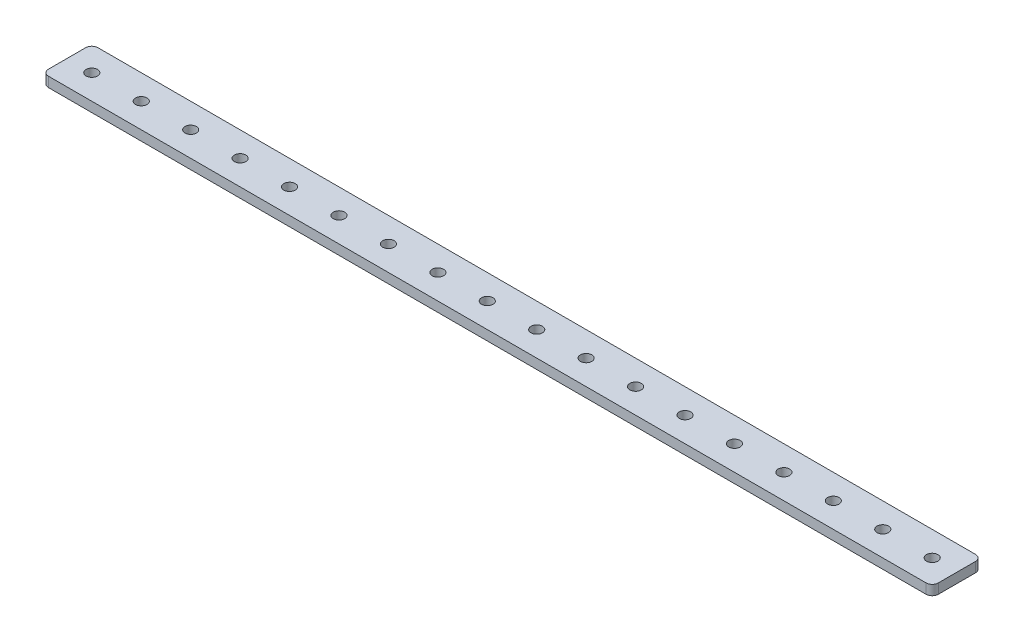
ISO-10303-21;
HEADER;
FILE_DESCRIPTION(('STEP AP214'),'2;1');
FILE_NAME('part.step','',(''),(''),'','','');
FILE_SCHEMA(('AUTOMOTIVE_DESIGN { 1 0 10303 214 1 1 1 1 }'));
ENDSEC;
DATA;
#1=APPLICATION_CONTEXT('core data for automotive mechanical design processes');
#2=APPLICATION_PROTOCOL_DEFINITION('international standard','automotive_design',2000,#1);
#3=PRODUCT_CONTEXT('',#1,'mechanical');
#4=PRODUCT('Part','Part','',(#3));
#5=PRODUCT_RELATED_PRODUCT_CATEGORY('part','',(#4));
#6=PRODUCT_DEFINITION_FORMATION('','',#4);
#7=PRODUCT_DEFINITION_CONTEXT('part definition',#1,'design');
#8=PRODUCT_DEFINITION('design','',#6,#7);
#9=PRODUCT_DEFINITION_SHAPE('','',#8);
#10=(LENGTH_UNIT() NAMED_UNIT(*) SI_UNIT(.MILLI.,.METRE.));
#11=(NAMED_UNIT(*) PLANE_ANGLE_UNIT() SI_UNIT($,.RADIAN.));
#12=(NAMED_UNIT(*) SI_UNIT($,.STERADIAN.) SOLID_ANGLE_UNIT());
#13=UNCERTAINTY_MEASURE_WITH_UNIT(LENGTH_MEASURE(1.E-05),#10,'distance_accuracy_value','');
#14=(GEOMETRIC_REPRESENTATION_CONTEXT(3) GLOBAL_UNCERTAINTY_ASSIGNED_CONTEXT((#13)) GLOBAL_UNIT_ASSIGNED_CONTEXT((#10,
#11,#12)) REPRESENTATION_CONTEXT('',''));
#15=CARTESIAN_POINT('',(0.,0.,0.));
#16=DIRECTION('',(0.,0.,1.));
#17=DIRECTION('',(1.,0.,0.));
#18=AXIS2_PLACEMENT_3D('',#15,#16,#17);
#19=CARTESIAN_POINT('',(-144.,1.6,8.));
#20=DIRECTION('',(1.,0.,0.));
#21=DIRECTION('',(0.,0.,-1.));
#22=AXIS2_PLACEMENT_3D('',#19,#20,#21);
#23=PLANE('',#22);
#24=DIRECTION('',(0.,0.,1.));
#25=VECTOR('',#24,1.);
#26=CARTESIAN_POINT('',(-144.,-1.6,8.));
#27=LINE('',#26,#25);
#28=CARTESIAN_POINT('',(-144.,-1.6,-6.));
#29=VERTEX_POINT('',#28);
#30=CARTESIAN_POINT('',(-144.,-1.6,6.));
#31=VERTEX_POINT('',#30);
#32=EDGE_CURVE('E127',#29,#31,#27,.T.);
#33=ORIENTED_EDGE('',*,*,#32,.T.);
#34=DIRECTION('',(0.,-1.,0.));
#35=VECTOR('',#34,1.);
#36=CARTESIAN_POINT('',(-144.,1.6,6.));
#37=LINE('',#36,#35);
#38=CARTESIAN_POINT('',(-144.,1.6,6.));
#39=VERTEX_POINT('',#38);
#40=EDGE_CURVE('E104',#31,#39,#37,.F.);
#41=ORIENTED_EDGE('',*,*,#40,.T.);
#42=DIRECTION('',(0.,0.,1.));
#43=VECTOR('',#42,1.);
#44=CARTESIAN_POINT('',(-144.,1.6,8.));
#45=LINE('',#44,#43);
#46=CARTESIAN_POINT('',(-144.,1.6,-6.));
#47=VERTEX_POINT('',#46);
#48=EDGE_CURVE('E137',#47,#39,#45,.T.);
#49=ORIENTED_EDGE('',*,*,#48,.F.);
#50=DIRECTION('',(0.,-1.,0.));
#51=VECTOR('',#50,1.);
#52=CARTESIAN_POINT('',(-144.,1.6,-6.));
#53=LINE('',#52,#51);
#54=EDGE_CURVE('E109',#47,#29,#53,.T.);
#55=ORIENTED_EDGE('',*,*,#54,.T.);
#56=EDGE_LOOP('',(#33,#41,#49,#55));
#57=FACE_BOUND('',#56,.T.);
#58=ADVANCED_FACE('F33',(#57),#23,.F.);
#59=CARTESIAN_POINT('',(-144.,1.6,8.));
#60=DIRECTION('',(0.,0.,-1.));
#61=DIRECTION('',(-1.,0.,0.));
#62=AXIS2_PLACEMENT_3D('',#59,#60,#61);
#63=PLANE('',#62);
#64=DIRECTION('',(1.,0.,0.));
#65=VECTOR('',#64,1.);
#66=CARTESIAN_POINT('',(-144.,1.6,8.));
#67=LINE('',#66,#65);
#68=CARTESIAN_POINT('',(-142.,1.6,8.));
#69=VERTEX_POINT('',#68);
#70=CARTESIAN_POINT('',(142.,1.6,8.));
#71=VERTEX_POINT('',#70);
#72=EDGE_CURVE('E119',#69,#71,#67,.T.);
#73=ORIENTED_EDGE('',*,*,#72,.F.);
#74=DIRECTION('',(0.,-1.,0.));
#75=VECTOR('',#74,1.);
#76=CARTESIAN_POINT('',(-142.,1.6,8.));
#77=LINE('',#76,#75);
#78=CARTESIAN_POINT('',(-142.,-1.6,8.));
#79=VERTEX_POINT('',#78);
#80=EDGE_CURVE('E103',#69,#79,#77,.T.);
#81=ORIENTED_EDGE('',*,*,#80,.T.);
#82=DIRECTION('',(1.,0.,0.));
#83=VECTOR('',#82,1.);
#84=CARTESIAN_POINT('',(-144.,-1.6,8.));
#85=LINE('',#84,#83);
#86=CARTESIAN_POINT('',(142.,-1.6,8.));
#87=VERTEX_POINT('',#86);
#88=EDGE_CURVE('E116',#79,#87,#85,.T.);
#89=ORIENTED_EDGE('',*,*,#88,.T.);
#90=DIRECTION('',(0.,-1.,0.));
#91=VECTOR('',#90,1.);
#92=CARTESIAN_POINT('',(142.,1.6,8.));
#93=LINE('',#92,#91);
#94=EDGE_CURVE('E121',#87,#71,#93,.F.);
#95=ORIENTED_EDGE('',*,*,#94,.T.);
#96=EDGE_LOOP('',(#73,#81,#89,#95));
#97=FACE_BOUND('',#96,.T.);
#98=ADVANCED_FACE('F115',(#97),#63,.F.);
#99=CARTESIAN_POINT('',(144.,1.6,8.));
#100=DIRECTION('',(-1.,0.,0.));
#101=DIRECTION('',(0.,0.,1.));
#102=AXIS2_PLACEMENT_3D('',#99,#100,#101);
#103=PLANE('',#102);
#104=DIRECTION('',(0.,0.,-1.));
#105=VECTOR('',#104,1.);
#106=CARTESIAN_POINT('',(144.,-1.6,8.));
#107=LINE('',#106,#105);
#108=CARTESIAN_POINT('',(144.,-1.6,6.));
#109=VERTEX_POINT('',#108);
#110=CARTESIAN_POINT('',(144.,-1.6,-6.));
#111=VERTEX_POINT('',#110);
#112=EDGE_CURVE('E126',#109,#111,#107,.T.);
#113=ORIENTED_EDGE('',*,*,#112,.T.);
#114=DIRECTION('',(0.,-1.,0.));
#115=VECTOR('',#114,1.);
#116=CARTESIAN_POINT('',(144.,1.6,-6.));
#117=LINE('',#116,#115);
#118=CARTESIAN_POINT('',(144.,1.6,-6.));
#119=VERTEX_POINT('',#118);
#120=EDGE_CURVE('E11',#111,#119,#117,.F.);
#121=ORIENTED_EDGE('',*,*,#120,.T.);
#122=DIRECTION('',(0.,0.,-1.));
#123=VECTOR('',#122,1.);
#124=CARTESIAN_POINT('',(144.,1.6,8.));
#125=LINE('',#124,#123);
#126=CARTESIAN_POINT('',(144.,1.6,6.));
#127=VERTEX_POINT('',#126);
#128=EDGE_CURVE('E259',#127,#119,#125,.T.);
#129=ORIENTED_EDGE('',*,*,#128,.F.);
#130=DIRECTION('',(0.,-1.,0.));
#131=VECTOR('',#130,1.);
#132=CARTESIAN_POINT('',(144.,1.6,6.));
#133=LINE('',#132,#131);
#134=EDGE_CURVE('E41',#127,#109,#133,.T.);
#135=ORIENTED_EDGE('',*,*,#134,.T.);
#136=EDGE_LOOP('',(#113,#121,#129,#135));
#137=FACE_BOUND('',#136,.T.);
#138=ADVANCED_FACE('F257',(#137),#103,.F.);
#139=CARTESIAN_POINT('',(-144.,1.6,-8.));
#140=DIRECTION('',(0.,0.,1.));
#141=DIRECTION('',(1.,0.,0.));
#142=AXIS2_PLACEMENT_3D('',#139,#140,#141);
#143=PLANE('',#142);
#144=DIRECTION('',(-1.,0.,0.));
#145=VECTOR('',#144,1.);
#146=CARTESIAN_POINT('',(-144.,-1.6,-8.));
#147=LINE('',#146,#145);
#148=CARTESIAN_POINT('',(142.,-1.6,-8.));
#149=VERTEX_POINT('',#148);
#150=CARTESIAN_POINT('',(-142.,-1.6,-8.));
#151=VERTEX_POINT('',#150);
#152=EDGE_CURVE('E130',#149,#151,#147,.T.);
#153=ORIENTED_EDGE('',*,*,#152,.T.);
#154=DIRECTION('',(0.,-1.,0.));
#155=VECTOR('',#154,1.);
#156=CARTESIAN_POINT('',(-142.,1.6,-8.));
#157=LINE('',#156,#155);
#158=CARTESIAN_POINT('',(-142.,1.6,-8.));
#159=VERTEX_POINT('',#158);
#160=EDGE_CURVE('E48',#151,#159,#157,.F.);
#161=ORIENTED_EDGE('',*,*,#160,.T.);
#162=DIRECTION('',(-1.,0.,0.));
#163=VECTOR('',#162,1.);
#164=CARTESIAN_POINT('',(-144.,1.6,-8.));
#165=LINE('',#164,#163);
#166=CARTESIAN_POINT('',(142.,1.6,-8.));
#167=VERTEX_POINT('',#166);
#168=EDGE_CURVE('E142',#167,#159,#165,.T.);
#169=ORIENTED_EDGE('',*,*,#168,.F.);
#170=DIRECTION('',(0.,-1.,0.));
#171=VECTOR('',#170,1.);
#172=CARTESIAN_POINT('',(142.,1.6,-8.));
#173=LINE('',#172,#171);
#174=EDGE_CURVE('E250',#167,#149,#173,.T.);
#175=ORIENTED_EDGE('',*,*,#174,.T.);
#176=EDGE_LOOP('',(#153,#161,#169,#175));
#177=FACE_BOUND('',#176,.T.);
#178=ADVANCED_FACE('F266',(#177),#143,.F.);
#179=CARTESIAN_POINT('',(-144.,1.6,-8.));
#180=DIRECTION('',(0.,-1.,0.));
#181=DIRECTION('',(0.,0.,-1.));
#182=AXIS2_PLACEMENT_3D('',#179,#180,#181);
#183=PLANE('',#182);
#184=CARTESIAN_POINT('',(-120.,1.6,0.));
#185=DIRECTION('',(0.,1.,0.));
#186=DIRECTION('',(0.,0.,1.));
#187=AXIS2_PLACEMENT_3D('',#184,#185,#186);
#188=CIRCLE('',#187,1.85);
#189=CARTESIAN_POINT('',(-120.,1.6,1.85));
#190=VERTEX_POINT('',#189);
#191=EDGE_CURVE('E276',#190,#190,#188,.T.);
#192=ORIENTED_EDGE('',*,*,#191,.F.);
#193=EDGE_LOOP('',(#192));
#194=FACE_BOUND('',#193,.T.);
#195=CARTESIAN_POINT('',(-136.,1.6,0.));
#196=DIRECTION('',(0.,1.,0.));
#197=DIRECTION('',(0.,0.,1.));
#198=AXIS2_PLACEMENT_3D('',#195,#196,#197);
#199=CIRCLE('',#198,1.85);
#200=CARTESIAN_POINT('',(-136.,1.6,1.85));
#201=VERTEX_POINT('',#200);
#202=EDGE_CURVE('E132',#201,#201,#199,.T.);
#203=ORIENTED_EDGE('',*,*,#202,.F.);
#204=EDGE_LOOP('',(#203));
#205=FACE_BOUND('',#204,.T.);
#206=ORIENTED_EDGE('',*,*,#48,.T.);
#207=CARTESIAN_POINT('',(-142.,1.6,6.));
#208=DIRECTION('',(0.,-1.,0.));
#209=DIRECTION('',(0.,0.,-1.));
#210=AXIS2_PLACEMENT_3D('',#207,#208,#209);
#211=CIRCLE('',#210,2.);
#212=EDGE_CURVE('E248',#39,#69,#211,.F.);
#213=ORIENTED_EDGE('',*,*,#212,.T.);
#214=ORIENTED_EDGE('',*,*,#72,.T.);
#215=CARTESIAN_POINT('',(142.,1.6,6.));
#216=DIRECTION('',(0.,-1.,0.));
#217=DIRECTION('',(0.,0.,-1.));
#218=AXIS2_PLACEMENT_3D('',#215,#216,#217);
#219=CIRCLE('',#218,2.);
#220=EDGE_CURVE('E243',#71,#127,#219,.F.);
#221=ORIENTED_EDGE('',*,*,#220,.T.);
#222=ORIENTED_EDGE('',*,*,#128,.T.);
#223=CARTESIAN_POINT('',(142.,1.6,-6.));
#224=DIRECTION('',(0.,-1.,0.));
#225=DIRECTION('',(0.,0.,-1.));
#226=AXIS2_PLACEMENT_3D('',#223,#224,#225);
#227=CIRCLE('',#226,2.);
#228=EDGE_CURVE('E55',#119,#167,#227,.F.);
#229=ORIENTED_EDGE('',*,*,#228,.T.);
#230=ORIENTED_EDGE('',*,*,#168,.T.);
#231=CARTESIAN_POINT('',(-142.,1.6,-6.));
#232=DIRECTION('',(0.,-1.,0.));
#233=DIRECTION('',(0.,0.,-1.));
#234=AXIS2_PLACEMENT_3D('',#231,#232,#233);
#235=CIRCLE('',#234,2.);
#236=EDGE_CURVE('E246',#159,#47,#235,.F.);
#237=ORIENTED_EDGE('',*,*,#236,.T.);
#238=EDGE_LOOP('',(#206,#213,#214,#221,#222,#229,#230,#237));
#239=FACE_BOUND('',#238,.T.);
#240=CARTESIAN_POINT('',(-104.,1.6,0.));
#241=DIRECTION('',(0.,1.,0.));
#242=DIRECTION('',(0.,0.,1.));
#243=AXIS2_PLACEMENT_3D('',#240,#241,#242);
#244=CIRCLE('',#243,1.85);
#245=CARTESIAN_POINT('',(-104.,1.6,1.85));
#246=VERTEX_POINT('',#245);
#247=EDGE_CURVE('E141',#246,#246,#244,.T.);
#248=ORIENTED_EDGE('',*,*,#247,.F.);
#249=EDGE_LOOP('',(#248));
#250=FACE_BOUND('',#249,.T.);
#251=CARTESIAN_POINT('',(-88.,1.6,0.));
#252=DIRECTION('',(0.,1.,0.));
#253=DIRECTION('',(0.,0.,1.));
#254=AXIS2_PLACEMENT_3D('',#251,#252,#253);
#255=CIRCLE('',#254,1.85);
#256=CARTESIAN_POINT('',(-88.,1.6,1.85));
#257=VERTEX_POINT('',#256);
#258=EDGE_CURVE('E148',#257,#257,#255,.T.);
#259=ORIENTED_EDGE('',*,*,#258,.F.);
#260=EDGE_LOOP('',(#259));
#261=FACE_BOUND('',#260,.T.);
#262=CARTESIAN_POINT('',(-72.,1.6,0.));
#263=DIRECTION('',(0.,1.,0.));
#264=DIRECTION('',(0.,0.,1.));
#265=AXIS2_PLACEMENT_3D('',#262,#263,#264);
#266=CIRCLE('',#265,1.85);
#267=CARTESIAN_POINT('',(-72.,1.6,1.85));
#268=VERTEX_POINT('',#267);
#269=EDGE_CURVE('E154',#268,#268,#266,.T.);
#270=ORIENTED_EDGE('',*,*,#269,.F.);
#271=EDGE_LOOP('',(#270));
#272=FACE_BOUND('',#271,.T.);
#273=CARTESIAN_POINT('',(-56.,1.6,0.));
#274=DIRECTION('',(0.,1.,0.));
#275=DIRECTION('',(0.,0.,1.));
#276=AXIS2_PLACEMENT_3D('',#273,#274,#275);
#277=CIRCLE('',#276,1.85);
#278=CARTESIAN_POINT('',(-56.,1.6,1.85));
#279=VERTEX_POINT('',#278);
#280=EDGE_CURVE('E160',#279,#279,#277,.T.);
#281=ORIENTED_EDGE('',*,*,#280,.F.);
#282=EDGE_LOOP('',(#281));
#283=FACE_BOUND('',#282,.T.);
#284=CARTESIAN_POINT('',(-40.,1.6,0.));
#285=DIRECTION('',(0.,1.,0.));
#286=DIRECTION('',(0.,0.,1.));
#287=AXIS2_PLACEMENT_3D('',#284,#285,#286);
#288=CIRCLE('',#287,1.85);
#289=CARTESIAN_POINT('',(-40.,1.6,1.85));
#290=VERTEX_POINT('',#289);
#291=EDGE_CURVE('E166',#290,#290,#288,.T.);
#292=ORIENTED_EDGE('',*,*,#291,.F.);
#293=EDGE_LOOP('',(#292));
#294=FACE_BOUND('',#293,.T.);
#295=CARTESIAN_POINT('',(-24.,1.6,0.));
#296=DIRECTION('',(0.,1.,0.));
#297=DIRECTION('',(0.,0.,1.));
#298=AXIS2_PLACEMENT_3D('',#295,#296,#297);
#299=CIRCLE('',#298,1.85);
#300=CARTESIAN_POINT('',(-24.,1.6,1.85));
#301=VERTEX_POINT('',#300);
#302=EDGE_CURVE('E172',#301,#301,#299,.T.);
#303=ORIENTED_EDGE('',*,*,#302,.F.);
#304=EDGE_LOOP('',(#303));
#305=FACE_BOUND('',#304,.T.);
#306=CARTESIAN_POINT('',(-7.99999999999998,1.6,0.));
#307=DIRECTION('',(0.,1.,0.));
#308=DIRECTION('',(0.,0.,1.));
#309=AXIS2_PLACEMENT_3D('',#306,#307,#308);
#310=CIRCLE('',#309,1.85);
#311=CARTESIAN_POINT('',(-7.99999999999998,1.6,1.85));
#312=VERTEX_POINT('',#311);
#313=EDGE_CURVE('E178',#312,#312,#310,.T.);
#314=ORIENTED_EDGE('',*,*,#313,.F.);
#315=EDGE_LOOP('',(#314));
#316=FACE_BOUND('',#315,.T.);
#317=CARTESIAN_POINT('',(8.00000000000002,1.6,0.));
#318=DIRECTION('',(0.,1.,0.));
#319=DIRECTION('',(0.,0.,1.));
#320=AXIS2_PLACEMENT_3D('',#317,#318,#319);
#321=CIRCLE('',#320,1.85);
#322=CARTESIAN_POINT('',(8.00000000000002,1.6,1.85));
#323=VERTEX_POINT('',#322);
#324=EDGE_CURVE('E184',#323,#323,#321,.T.);
#325=ORIENTED_EDGE('',*,*,#324,.F.);
#326=EDGE_LOOP('',(#325));
#327=FACE_BOUND('',#326,.T.);
#328=CARTESIAN_POINT('',(24.,1.6,0.));
#329=DIRECTION('',(0.,1.,0.));
#330=DIRECTION('',(0.,0.,1.));
#331=AXIS2_PLACEMENT_3D('',#328,#329,#330);
#332=CIRCLE('',#331,1.85);
#333=CARTESIAN_POINT('',(24.,1.6,1.85));
#334=VERTEX_POINT('',#333);
#335=EDGE_CURVE('E190',#334,#334,#332,.T.);
#336=ORIENTED_EDGE('',*,*,#335,.F.);
#337=EDGE_LOOP('',(#336));
#338=FACE_BOUND('',#337,.T.);
#339=CARTESIAN_POINT('',(40.,1.6,0.));
#340=DIRECTION('',(0.,1.,0.));
#341=DIRECTION('',(0.,0.,1.));
#342=AXIS2_PLACEMENT_3D('',#339,#340,#341);
#343=CIRCLE('',#342,1.85);
#344=CARTESIAN_POINT('',(40.,1.6,1.85));
#345=VERTEX_POINT('',#344);
#346=EDGE_CURVE('E196',#345,#345,#343,.T.);
#347=ORIENTED_EDGE('',*,*,#346,.F.);
#348=EDGE_LOOP('',(#347));
#349=FACE_BOUND('',#348,.T.);
#350=CARTESIAN_POINT('',(56.,1.6,0.));
#351=DIRECTION('',(0.,1.,0.));
#352=DIRECTION('',(0.,0.,1.));
#353=AXIS2_PLACEMENT_3D('',#350,#351,#352);
#354=CIRCLE('',#353,1.85);
#355=CARTESIAN_POINT('',(56.,1.6,1.85));
#356=VERTEX_POINT('',#355);
#357=EDGE_CURVE('E202',#356,#356,#354,.T.);
#358=ORIENTED_EDGE('',*,*,#357,.F.);
#359=EDGE_LOOP('',(#358));
#360=FACE_BOUND('',#359,.T.);
#361=CARTESIAN_POINT('',(72.,1.6,0.));
#362=DIRECTION('',(0.,1.,0.));
#363=DIRECTION('',(0.,0.,1.));
#364=AXIS2_PLACEMENT_3D('',#361,#362,#363);
#365=CIRCLE('',#364,1.85);
#366=CARTESIAN_POINT('',(72.,1.6,1.85));
#367=VERTEX_POINT('',#366);
#368=EDGE_CURVE('E208',#367,#367,#365,.T.);
#369=ORIENTED_EDGE('',*,*,#368,.F.);
#370=EDGE_LOOP('',(#369));
#371=FACE_BOUND('',#370,.T.);
#372=CARTESIAN_POINT('',(88.,1.6,0.));
#373=DIRECTION('',(0.,1.,0.));
#374=DIRECTION('',(0.,0.,1.));
#375=AXIS2_PLACEMENT_3D('',#372,#373,#374);
#376=CIRCLE('',#375,1.85);
#377=CARTESIAN_POINT('',(88.,1.6,1.85));
#378=VERTEX_POINT('',#377);
#379=EDGE_CURVE('E214',#378,#378,#376,.T.);
#380=ORIENTED_EDGE('',*,*,#379,.F.);
#381=EDGE_LOOP('',(#380));
#382=FACE_BOUND('',#381,.T.);
#383=CARTESIAN_POINT('',(104.,1.6,0.));
#384=DIRECTION('',(0.,1.,0.));
#385=DIRECTION('',(0.,0.,1.));
#386=AXIS2_PLACEMENT_3D('',#383,#384,#385);
#387=CIRCLE('',#386,1.85);
#388=CARTESIAN_POINT('',(104.,1.6,1.85));
#389=VERTEX_POINT('',#388);
#390=EDGE_CURVE('E220',#389,#389,#387,.T.);
#391=ORIENTED_EDGE('',*,*,#390,.F.);
#392=EDGE_LOOP('',(#391));
#393=FACE_BOUND('',#392,.T.);
#394=CARTESIAN_POINT('',(120.,1.6,0.));
#395=DIRECTION('',(0.,1.,0.));
#396=DIRECTION('',(0.,0.,1.));
#397=AXIS2_PLACEMENT_3D('',#394,#395,#396);
#398=CIRCLE('',#397,1.85);
#399=CARTESIAN_POINT('',(120.,1.6,1.85));
#400=VERTEX_POINT('',#399);
#401=EDGE_CURVE('E226',#400,#400,#398,.T.);
#402=ORIENTED_EDGE('',*,*,#401,.F.);
#403=EDGE_LOOP('',(#402));
#404=FACE_BOUND('',#403,.T.);
#405=CARTESIAN_POINT('',(136.,1.6,0.));
#406=DIRECTION('',(0.,1.,0.));
#407=DIRECTION('',(0.,0.,1.));
#408=AXIS2_PLACEMENT_3D('',#405,#406,#407);
#409=CIRCLE('',#408,1.85);
#410=CARTESIAN_POINT('',(136.,1.6,1.85));
#411=VERTEX_POINT('',#410);
#412=EDGE_CURVE('E232',#411,#411,#409,.T.);
#413=ORIENTED_EDGE('',*,*,#412,.F.);
#414=EDGE_LOOP('',(#413));
#415=FACE_BOUND('',#414,.T.);
#416=ADVANCED_FACE('F295',(#194,#205,#239,#250,#261,#272,#283,#294,#305,#316,#327,#338,#349,
#360,#371,#382,#393,#404,#415),#183,.F.);
#417=CARTESIAN_POINT('',(-144.,-1.6,-8.));
#418=DIRECTION('',(0.,-1.,0.));
#419=DIRECTION('',(0.,0.,-1.));
#420=AXIS2_PLACEMENT_3D('',#417,#418,#419);
#421=PLANE('',#420);
#422=CARTESIAN_POINT('',(-120.,-1.6,0.));
#423=DIRECTION('',(0.,-1.,0.));
#424=DIRECTION('',(0.,0.,-1.));
#425=AXIS2_PLACEMENT_3D('',#422,#423,#424);
#426=CIRCLE('',#425,1.85);
#427=CARTESIAN_POINT('',(-120.,-1.6,-1.85));
#428=VERTEX_POINT('',#427);
#429=EDGE_CURVE('E281',#428,#428,#426,.F.);
#430=ORIENTED_EDGE('',*,*,#429,.T.);
#431=EDGE_LOOP('',(#430));
#432=FACE_BOUND('',#431,.T.);
#433=CARTESIAN_POINT('',(-136.,-1.6,0.));
#434=DIRECTION('',(0.,-1.,0.));
#435=DIRECTION('',(0.,0.,-1.));
#436=AXIS2_PLACEMENT_3D('',#433,#434,#435);
#437=CIRCLE('',#436,1.85);
#438=CARTESIAN_POINT('',(-136.,-1.6,-1.85));
#439=VERTEX_POINT('',#438);
#440=EDGE_CURVE('E273',#439,#439,#437,.F.);
#441=ORIENTED_EDGE('',*,*,#440,.T.);
#442=EDGE_LOOP('',(#441));
#443=FACE_BOUND('',#442,.T.);
#444=ORIENTED_EDGE('',*,*,#88,.F.);
#445=CARTESIAN_POINT('',(-142.,-1.6,6.));
#446=DIRECTION('',(0.,-1.,0.));
#447=DIRECTION('',(0.,0.,-1.));
#448=AXIS2_PLACEMENT_3D('',#445,#446,#447);
#449=CIRCLE('',#448,2.);
#450=EDGE_CURVE('E99',#79,#31,#449,.T.);
#451=ORIENTED_EDGE('',*,*,#450,.T.);
#452=ORIENTED_EDGE('',*,*,#32,.F.);
#453=CARTESIAN_POINT('',(-142.,-1.6,-6.));
#454=DIRECTION('',(0.,-1.,0.));
#455=DIRECTION('',(0.,0.,-1.));
#456=AXIS2_PLACEMENT_3D('',#453,#454,#455);
#457=CIRCLE('',#456,2.);
#458=EDGE_CURVE('E110',#29,#151,#457,.T.);
#459=ORIENTED_EDGE('',*,*,#458,.T.);
#460=ORIENTED_EDGE('',*,*,#152,.F.);
#461=CARTESIAN_POINT('',(142.,-1.6,-6.));
#462=DIRECTION('',(0.,-1.,0.));
#463=DIRECTION('',(0.,0.,-1.));
#464=AXIS2_PLACEMENT_3D('',#461,#462,#463);
#465=CIRCLE('',#464,2.);
#466=EDGE_CURVE('E237',#149,#111,#465,.T.);
#467=ORIENTED_EDGE('',*,*,#466,.T.);
#468=ORIENTED_EDGE('',*,*,#112,.F.);
#469=CARTESIAN_POINT('',(142.,-1.6,6.));
#470=DIRECTION('',(0.,-1.,0.));
#471=DIRECTION('',(0.,0.,-1.));
#472=AXIS2_PLACEMENT_3D('',#469,#470,#471);
#473=CIRCLE('',#472,2.);
#474=EDGE_CURVE('E120',#109,#87,#473,.T.);
#475=ORIENTED_EDGE('',*,*,#474,.T.);
#476=EDGE_LOOP('',(#444,#451,#452,#459,#460,#467,#468,#475));
#477=FACE_BOUND('',#476,.T.);
#478=CARTESIAN_POINT('',(-104.,-1.6,0.));
#479=DIRECTION('',(0.,-1.,0.));
#480=DIRECTION('',(0.,0.,-1.));
#481=AXIS2_PLACEMENT_3D('',#478,#479,#480);
#482=CIRCLE('',#481,1.85);
#483=CARTESIAN_POINT('',(-104.,-1.6,-1.85));
#484=VERTEX_POINT('',#483);
#485=EDGE_CURVE('E138',#484,#484,#482,.F.);
#486=ORIENTED_EDGE('',*,*,#485,.T.);
#487=EDGE_LOOP('',(#486));
#488=FACE_BOUND('',#487,.T.);
#489=CARTESIAN_POINT('',(-88.,-1.6,0.));
#490=DIRECTION('',(0.,-1.,0.));
#491=DIRECTION('',(0.,0.,-1.));
#492=AXIS2_PLACEMENT_3D('',#489,#490,#491);
#493=CIRCLE('',#492,1.85);
#494=CARTESIAN_POINT('',(-88.,-1.6,-1.85));
#495=VERTEX_POINT('',#494);
#496=EDGE_CURVE('E145',#495,#495,#493,.F.);
#497=ORIENTED_EDGE('',*,*,#496,.T.);
#498=EDGE_LOOP('',(#497));
#499=FACE_BOUND('',#498,.T.);
#500=CARTESIAN_POINT('',(-72.,-1.6,0.));
#501=DIRECTION('',(0.,-1.,0.));
#502=DIRECTION('',(0.,0.,-1.));
#503=AXIS2_PLACEMENT_3D('',#500,#501,#502);
#504=CIRCLE('',#503,1.85);
#505=CARTESIAN_POINT('',(-72.,-1.6,-1.85));
#506=VERTEX_POINT('',#505);
#507=EDGE_CURVE('E151',#506,#506,#504,.F.);
#508=ORIENTED_EDGE('',*,*,#507,.T.);
#509=EDGE_LOOP('',(#508));
#510=FACE_BOUND('',#509,.T.);
#511=CARTESIAN_POINT('',(-56.,-1.6,0.));
#512=DIRECTION('',(0.,-1.,0.));
#513=DIRECTION('',(0.,0.,-1.));
#514=AXIS2_PLACEMENT_3D('',#511,#512,#513);
#515=CIRCLE('',#514,1.85);
#516=CARTESIAN_POINT('',(-56.,-1.6,-1.85));
#517=VERTEX_POINT('',#516);
#518=EDGE_CURVE('E157',#517,#517,#515,.F.);
#519=ORIENTED_EDGE('',*,*,#518,.T.);
#520=EDGE_LOOP('',(#519));
#521=FACE_BOUND('',#520,.T.);
#522=CARTESIAN_POINT('',(-40.,-1.6,0.));
#523=DIRECTION('',(0.,-1.,0.));
#524=DIRECTION('',(0.,0.,-1.));
#525=AXIS2_PLACEMENT_3D('',#522,#523,#524);
#526=CIRCLE('',#525,1.85);
#527=CARTESIAN_POINT('',(-40.,-1.6,-1.85));
#528=VERTEX_POINT('',#527);
#529=EDGE_CURVE('E163',#528,#528,#526,.F.);
#530=ORIENTED_EDGE('',*,*,#529,.T.);
#531=EDGE_LOOP('',(#530));
#532=FACE_BOUND('',#531,.T.);
#533=CARTESIAN_POINT('',(-24.,-1.6,0.));
#534=DIRECTION('',(0.,-1.,0.));
#535=DIRECTION('',(0.,0.,-1.));
#536=AXIS2_PLACEMENT_3D('',#533,#534,#535);
#537=CIRCLE('',#536,1.85);
#538=CARTESIAN_POINT('',(-24.,-1.6,-1.85));
#539=VERTEX_POINT('',#538);
#540=EDGE_CURVE('E169',#539,#539,#537,.F.);
#541=ORIENTED_EDGE('',*,*,#540,.T.);
#542=EDGE_LOOP('',(#541));
#543=FACE_BOUND('',#542,.T.);
#544=CARTESIAN_POINT('',(-7.99999999999998,-1.6,0.));
#545=DIRECTION('',(0.,-1.,0.));
#546=DIRECTION('',(0.,0.,-1.));
#547=AXIS2_PLACEMENT_3D('',#544,#545,#546);
#548=CIRCLE('',#547,1.85);
#549=CARTESIAN_POINT('',(-7.99999999999998,-1.6,-1.85));
#550=VERTEX_POINT('',#549);
#551=EDGE_CURVE('E175',#550,#550,#548,.F.);
#552=ORIENTED_EDGE('',*,*,#551,.T.);
#553=EDGE_LOOP('',(#552));
#554=FACE_BOUND('',#553,.T.);
#555=CARTESIAN_POINT('',(8.00000000000002,-1.6,0.));
#556=DIRECTION('',(0.,-1.,0.));
#557=DIRECTION('',(0.,0.,-1.));
#558=AXIS2_PLACEMENT_3D('',#555,#556,#557);
#559=CIRCLE('',#558,1.85);
#560=CARTESIAN_POINT('',(8.00000000000002,-1.6,-1.85));
#561=VERTEX_POINT('',#560);
#562=EDGE_CURVE('E181',#561,#561,#559,.F.);
#563=ORIENTED_EDGE('',*,*,#562,.T.);
#564=EDGE_LOOP('',(#563));
#565=FACE_BOUND('',#564,.T.);
#566=CARTESIAN_POINT('',(24.,-1.6,0.));
#567=DIRECTION('',(0.,-1.,0.));
#568=DIRECTION('',(0.,0.,-1.));
#569=AXIS2_PLACEMENT_3D('',#566,#567,#568);
#570=CIRCLE('',#569,1.85);
#571=CARTESIAN_POINT('',(24.,-1.6,-1.85));
#572=VERTEX_POINT('',#571);
#573=EDGE_CURVE('E187',#572,#572,#570,.F.);
#574=ORIENTED_EDGE('',*,*,#573,.T.);
#575=EDGE_LOOP('',(#574));
#576=FACE_BOUND('',#575,.T.);
#577=CARTESIAN_POINT('',(40.,-1.6,0.));
#578=DIRECTION('',(0.,-1.,0.));
#579=DIRECTION('',(0.,0.,-1.));
#580=AXIS2_PLACEMENT_3D('',#577,#578,#579);
#581=CIRCLE('',#580,1.85);
#582=CARTESIAN_POINT('',(40.,-1.6,-1.85));
#583=VERTEX_POINT('',#582);
#584=EDGE_CURVE('E193',#583,#583,#581,.F.);
#585=ORIENTED_EDGE('',*,*,#584,.T.);
#586=EDGE_LOOP('',(#585));
#587=FACE_BOUND('',#586,.T.);
#588=CARTESIAN_POINT('',(56.,-1.6,0.));
#589=DIRECTION('',(0.,-1.,0.));
#590=DIRECTION('',(0.,0.,-1.));
#591=AXIS2_PLACEMENT_3D('',#588,#589,#590);
#592=CIRCLE('',#591,1.85);
#593=CARTESIAN_POINT('',(56.,-1.6,-1.85));
#594=VERTEX_POINT('',#593);
#595=EDGE_CURVE('E199',#594,#594,#592,.F.);
#596=ORIENTED_EDGE('',*,*,#595,.T.);
#597=EDGE_LOOP('',(#596));
#598=FACE_BOUND('',#597,.T.);
#599=CARTESIAN_POINT('',(72.,-1.6,0.));
#600=DIRECTION('',(0.,-1.,0.));
#601=DIRECTION('',(0.,0.,-1.));
#602=AXIS2_PLACEMENT_3D('',#599,#600,#601);
#603=CIRCLE('',#602,1.85);
#604=CARTESIAN_POINT('',(72.,-1.6,-1.85));
#605=VERTEX_POINT('',#604);
#606=EDGE_CURVE('E205',#605,#605,#603,.F.);
#607=ORIENTED_EDGE('',*,*,#606,.T.);
#608=EDGE_LOOP('',(#607));
#609=FACE_BOUND('',#608,.T.);
#610=CARTESIAN_POINT('',(88.,-1.6,0.));
#611=DIRECTION('',(0.,-1.,0.));
#612=DIRECTION('',(0.,0.,-1.));
#613=AXIS2_PLACEMENT_3D('',#610,#611,#612);
#614=CIRCLE('',#613,1.85);
#615=CARTESIAN_POINT('',(88.,-1.6,-1.85));
#616=VERTEX_POINT('',#615);
#617=EDGE_CURVE('E211',#616,#616,#614,.F.);
#618=ORIENTED_EDGE('',*,*,#617,.T.);
#619=EDGE_LOOP('',(#618));
#620=FACE_BOUND('',#619,.T.);
#621=CARTESIAN_POINT('',(104.,-1.6,0.));
#622=DIRECTION('',(0.,-1.,0.));
#623=DIRECTION('',(0.,0.,-1.));
#624=AXIS2_PLACEMENT_3D('',#621,#622,#623);
#625=CIRCLE('',#624,1.85);
#626=CARTESIAN_POINT('',(104.,-1.6,-1.85));
#627=VERTEX_POINT('',#626);
#628=EDGE_CURVE('E217',#627,#627,#625,.F.);
#629=ORIENTED_EDGE('',*,*,#628,.T.);
#630=EDGE_LOOP('',(#629));
#631=FACE_BOUND('',#630,.T.);
#632=CARTESIAN_POINT('',(120.,-1.6,0.));
#633=DIRECTION('',(0.,-1.,0.));
#634=DIRECTION('',(0.,0.,-1.));
#635=AXIS2_PLACEMENT_3D('',#632,#633,#634);
#636=CIRCLE('',#635,1.85);
#637=CARTESIAN_POINT('',(120.,-1.6,-1.85));
#638=VERTEX_POINT('',#637);
#639=EDGE_CURVE('E223',#638,#638,#636,.F.);
#640=ORIENTED_EDGE('',*,*,#639,.T.);
#641=EDGE_LOOP('',(#640));
#642=FACE_BOUND('',#641,.T.);
#643=CARTESIAN_POINT('',(136.,-1.6,0.));
#644=DIRECTION('',(0.,-1.,0.));
#645=DIRECTION('',(0.,0.,-1.));
#646=AXIS2_PLACEMENT_3D('',#643,#644,#645);
#647=CIRCLE('',#646,1.85);
#648=CARTESIAN_POINT('',(136.,-1.6,-1.85));
#649=VERTEX_POINT('',#648);
#650=EDGE_CURVE('E229',#649,#649,#647,.F.);
#651=ORIENTED_EDGE('',*,*,#650,.T.);
#652=EDGE_LOOP('',(#651));
#653=FACE_BOUND('',#652,.T.);
#654=ADVANCED_FACE('F123',(#432,#443,#477,#488,#499,#510,#521,#532,#543,#554,#565,#576,#587,
#598,#609,#620,#631,#642,#653),#421,.T.);
#655=CARTESIAN_POINT('',(-136.,-1.601,0.));
#656=DIRECTION('',(0.,1.,0.));
#657=DIRECTION('',(0.,0.,1.));
#658=AXIS2_PLACEMENT_3D('',#655,#656,#657);
#659=CYLINDRICAL_SURFACE('',#658,1.85);
#660=ORIENTED_EDGE('',*,*,#440,.F.);
#661=EDGE_LOOP('',(#660));
#662=FACE_BOUND('',#661,.T.);
#663=ORIENTED_EDGE('',*,*,#202,.T.);
#664=EDGE_LOOP('',(#663));
#665=FACE_BOUND('',#664,.T.);
#666=ADVANCED_FACE('F291',(#662,#665),#659,.F.);
#667=CARTESIAN_POINT('',(-120.,-1.601,0.));
#668=DIRECTION('',(0.,1.,0.));
#669=DIRECTION('',(0.,0.,1.));
#670=AXIS2_PLACEMENT_3D('',#667,#668,#669);
#671=CYLINDRICAL_SURFACE('',#670,1.85);
#672=ORIENTED_EDGE('',*,*,#429,.F.);
#673=EDGE_LOOP('',(#672));
#674=FACE_BOUND('',#673,.T.);
#675=ORIENTED_EDGE('',*,*,#191,.T.);
#676=EDGE_LOOP('',(#675));
#677=FACE_BOUND('',#676,.T.);
#678=ADVANCED_FACE('F287',(#674,#677),#671,.F.);
#679=CARTESIAN_POINT('',(-104.,-1.601,0.));
#680=DIRECTION('',(0.,1.,0.));
#681=DIRECTION('',(0.,0.,1.));
#682=AXIS2_PLACEMENT_3D('',#679,#680,#681);
#683=CYLINDRICAL_SURFACE('',#682,1.85);
#684=ORIENTED_EDGE('',*,*,#485,.F.);
#685=EDGE_LOOP('',(#684));
#686=FACE_BOUND('',#685,.T.);
#687=ORIENTED_EDGE('',*,*,#247,.T.);
#688=EDGE_LOOP('',(#687));
#689=FACE_BOUND('',#688,.T.);
#690=ADVANCED_FACE('F290',(#686,#689),#683,.F.);
#691=CARTESIAN_POINT('',(-88.,-1.601,0.));
#692=DIRECTION('',(0.,1.,0.));
#693=DIRECTION('',(0.,0.,1.));
#694=AXIS2_PLACEMENT_3D('',#691,#692,#693);
#695=CYLINDRICAL_SURFACE('',#694,1.85);
#696=ORIENTED_EDGE('',*,*,#496,.F.);
#697=EDGE_LOOP('',(#696));
#698=FACE_BOUND('',#697,.T.);
#699=ORIENTED_EDGE('',*,*,#258,.T.);
#700=EDGE_LOOP('',(#699));
#701=FACE_BOUND('',#700,.T.);
#702=ADVANCED_FACE('F360',(#698,#701),#695,.F.);
#703=CARTESIAN_POINT('',(-72.,-1.601,0.));
#704=DIRECTION('',(0.,1.,0.));
#705=DIRECTION('',(0.,0.,1.));
#706=AXIS2_PLACEMENT_3D('',#703,#704,#705);
#707=CYLINDRICAL_SURFACE('',#706,1.85);
#708=ORIENTED_EDGE('',*,*,#507,.F.);
#709=EDGE_LOOP('',(#708));
#710=FACE_BOUND('',#709,.T.);
#711=ORIENTED_EDGE('',*,*,#269,.T.);
#712=EDGE_LOOP('',(#711));
#713=FACE_BOUND('',#712,.T.);
#714=ADVANCED_FACE('F364',(#710,#713),#707,.F.);
#715=CARTESIAN_POINT('',(-56.,-1.601,0.));
#716=DIRECTION('',(0.,1.,0.));
#717=DIRECTION('',(0.,0.,1.));
#718=AXIS2_PLACEMENT_3D('',#715,#716,#717);
#719=CYLINDRICAL_SURFACE('',#718,1.85);
#720=ORIENTED_EDGE('',*,*,#518,.F.);
#721=EDGE_LOOP('',(#720));
#722=FACE_BOUND('',#721,.T.);
#723=ORIENTED_EDGE('',*,*,#280,.T.);
#724=EDGE_LOOP('',(#723));
#725=FACE_BOUND('',#724,.T.);
#726=ADVANCED_FACE('F368',(#722,#725),#719,.F.);
#727=CARTESIAN_POINT('',(-40.,-1.601,0.));
#728=DIRECTION('',(0.,1.,0.));
#729=DIRECTION('',(0.,0.,1.));
#730=AXIS2_PLACEMENT_3D('',#727,#728,#729);
#731=CYLINDRICAL_SURFACE('',#730,1.85);
#732=ORIENTED_EDGE('',*,*,#529,.F.);
#733=EDGE_LOOP('',(#732));
#734=FACE_BOUND('',#733,.T.);
#735=ORIENTED_EDGE('',*,*,#291,.T.);
#736=EDGE_LOOP('',(#735));
#737=FACE_BOUND('',#736,.T.);
#738=ADVANCED_FACE('F372',(#734,#737),#731,.F.);
#739=CARTESIAN_POINT('',(-24.,-1.601,0.));
#740=DIRECTION('',(0.,1.,0.));
#741=DIRECTION('',(0.,0.,1.));
#742=AXIS2_PLACEMENT_3D('',#739,#740,#741);
#743=CYLINDRICAL_SURFACE('',#742,1.85);
#744=ORIENTED_EDGE('',*,*,#540,.F.);
#745=EDGE_LOOP('',(#744));
#746=FACE_BOUND('',#745,.T.);
#747=ORIENTED_EDGE('',*,*,#302,.T.);
#748=EDGE_LOOP('',(#747));
#749=FACE_BOUND('',#748,.T.);
#750=ADVANCED_FACE('F376',(#746,#749),#743,.F.);
#751=CARTESIAN_POINT('',(-7.99999999999998,-1.601,0.));
#752=DIRECTION('',(0.,1.,0.));
#753=DIRECTION('',(0.,0.,1.));
#754=AXIS2_PLACEMENT_3D('',#751,#752,#753);
#755=CYLINDRICAL_SURFACE('',#754,1.85);
#756=ORIENTED_EDGE('',*,*,#551,.F.);
#757=EDGE_LOOP('',(#756));
#758=FACE_BOUND('',#757,.T.);
#759=ORIENTED_EDGE('',*,*,#313,.T.);
#760=EDGE_LOOP('',(#759));
#761=FACE_BOUND('',#760,.T.);
#762=ADVANCED_FACE('F380',(#758,#761),#755,.F.);
#763=CARTESIAN_POINT('',(8.00000000000002,-1.601,0.));
#764=DIRECTION('',(0.,1.,0.));
#765=DIRECTION('',(0.,0.,1.));
#766=AXIS2_PLACEMENT_3D('',#763,#764,#765);
#767=CYLINDRICAL_SURFACE('',#766,1.85);
#768=ORIENTED_EDGE('',*,*,#562,.F.);
#769=EDGE_LOOP('',(#768));
#770=FACE_BOUND('',#769,.T.);
#771=ORIENTED_EDGE('',*,*,#324,.T.);
#772=EDGE_LOOP('',(#771));
#773=FACE_BOUND('',#772,.T.);
#774=ADVANCED_FACE('F384',(#770,#773),#767,.F.);
#775=CARTESIAN_POINT('',(24.,-1.601,0.));
#776=DIRECTION('',(0.,1.,0.));
#777=DIRECTION('',(0.,0.,1.));
#778=AXIS2_PLACEMENT_3D('',#775,#776,#777);
#779=CYLINDRICAL_SURFACE('',#778,1.85);
#780=ORIENTED_EDGE('',*,*,#573,.F.);
#781=EDGE_LOOP('',(#780));
#782=FACE_BOUND('',#781,.T.);
#783=ORIENTED_EDGE('',*,*,#335,.T.);
#784=EDGE_LOOP('',(#783));
#785=FACE_BOUND('',#784,.T.);
#786=ADVANCED_FACE('F388',(#782,#785),#779,.F.);
#787=CARTESIAN_POINT('',(40.,-1.601,0.));
#788=DIRECTION('',(0.,1.,0.));
#789=DIRECTION('',(0.,0.,1.));
#790=AXIS2_PLACEMENT_3D('',#787,#788,#789);
#791=CYLINDRICAL_SURFACE('',#790,1.85);
#792=ORIENTED_EDGE('',*,*,#584,.F.);
#793=EDGE_LOOP('',(#792));
#794=FACE_BOUND('',#793,.T.);
#795=ORIENTED_EDGE('',*,*,#346,.T.);
#796=EDGE_LOOP('',(#795));
#797=FACE_BOUND('',#796,.T.);
#798=ADVANCED_FACE('F392',(#794,#797),#791,.F.);
#799=CARTESIAN_POINT('',(56.,-1.601,0.));
#800=DIRECTION('',(0.,1.,0.));
#801=DIRECTION('',(0.,0.,1.));
#802=AXIS2_PLACEMENT_3D('',#799,#800,#801);
#803=CYLINDRICAL_SURFACE('',#802,1.85);
#804=ORIENTED_EDGE('',*,*,#595,.F.);
#805=EDGE_LOOP('',(#804));
#806=FACE_BOUND('',#805,.T.);
#807=ORIENTED_EDGE('',*,*,#357,.T.);
#808=EDGE_LOOP('',(#807));
#809=FACE_BOUND('',#808,.T.);
#810=ADVANCED_FACE('F396',(#806,#809),#803,.F.);
#811=CARTESIAN_POINT('',(72.,-1.601,0.));
#812=DIRECTION('',(0.,1.,0.));
#813=DIRECTION('',(0.,0.,1.));
#814=AXIS2_PLACEMENT_3D('',#811,#812,#813);
#815=CYLINDRICAL_SURFACE('',#814,1.85);
#816=ORIENTED_EDGE('',*,*,#606,.F.);
#817=EDGE_LOOP('',(#816));
#818=FACE_BOUND('',#817,.T.);
#819=ORIENTED_EDGE('',*,*,#368,.T.);
#820=EDGE_LOOP('',(#819));
#821=FACE_BOUND('',#820,.T.);
#822=ADVANCED_FACE('F400',(#818,#821),#815,.F.);
#823=CARTESIAN_POINT('',(88.,-1.601,0.));
#824=DIRECTION('',(0.,1.,0.));
#825=DIRECTION('',(0.,0.,1.));
#826=AXIS2_PLACEMENT_3D('',#823,#824,#825);
#827=CYLINDRICAL_SURFACE('',#826,1.85);
#828=ORIENTED_EDGE('',*,*,#617,.F.);
#829=EDGE_LOOP('',(#828));
#830=FACE_BOUND('',#829,.T.);
#831=ORIENTED_EDGE('',*,*,#379,.T.);
#832=EDGE_LOOP('',(#831));
#833=FACE_BOUND('',#832,.T.);
#834=ADVANCED_FACE('F404',(#830,#833),#827,.F.);
#835=CARTESIAN_POINT('',(104.,-1.601,0.));
#836=DIRECTION('',(0.,1.,0.));
#837=DIRECTION('',(0.,0.,1.));
#838=AXIS2_PLACEMENT_3D('',#835,#836,#837);
#839=CYLINDRICAL_SURFACE('',#838,1.85);
#840=ORIENTED_EDGE('',*,*,#628,.F.);
#841=EDGE_LOOP('',(#840));
#842=FACE_BOUND('',#841,.T.);
#843=ORIENTED_EDGE('',*,*,#390,.T.);
#844=EDGE_LOOP('',(#843));
#845=FACE_BOUND('',#844,.T.);
#846=ADVANCED_FACE('F345',(#842,#845),#839,.F.);
#847=CARTESIAN_POINT('',(120.,-1.601,0.));
#848=DIRECTION('',(0.,1.,0.));
#849=DIRECTION('',(0.,0.,1.));
#850=AXIS2_PLACEMENT_3D('',#847,#848,#849);
#851=CYLINDRICAL_SURFACE('',#850,1.85);
#852=ORIENTED_EDGE('',*,*,#639,.F.);
#853=EDGE_LOOP('',(#852));
#854=FACE_BOUND('',#853,.T.);
#855=ORIENTED_EDGE('',*,*,#401,.T.);
#856=EDGE_LOOP('',(#855));
#857=FACE_BOUND('',#856,.T.);
#858=ADVANCED_FACE('F336',(#854,#857),#851,.F.);
#859=CARTESIAN_POINT('',(136.,-1.601,0.));
#860=DIRECTION('',(0.,1.,0.));
#861=DIRECTION('',(0.,0.,1.));
#862=AXIS2_PLACEMENT_3D('',#859,#860,#861);
#863=CYLINDRICAL_SURFACE('',#862,1.85);
#864=ORIENTED_EDGE('',*,*,#650,.F.);
#865=EDGE_LOOP('',(#864));
#866=FACE_BOUND('',#865,.T.);
#867=ORIENTED_EDGE('',*,*,#412,.T.);
#868=EDGE_LOOP('',(#867));
#869=FACE_BOUND('',#868,.T.);
#870=ADVANCED_FACE('F334',(#866,#869),#863,.F.);
#871=CARTESIAN_POINT('',(-142.,1.6,6.));
#872=DIRECTION('',(0.,-1.,0.));
#873=DIRECTION('',(0.,0.,-1.));
#874=AXIS2_PLACEMENT_3D('',#871,#872,#873);
#875=CYLINDRICAL_SURFACE('',#874,2.);
#876=ORIENTED_EDGE('',*,*,#212,.F.);
#877=ORIENTED_EDGE('',*,*,#40,.F.);
#878=ORIENTED_EDGE('',*,*,#450,.F.);
#879=ORIENTED_EDGE('',*,*,#80,.F.);
#880=EDGE_LOOP('',(#876,#877,#878,#879));
#881=FACE_BOUND('',#880,.T.);
#882=ADVANCED_FACE('F102',(#881),#875,.T.);
#883=CARTESIAN_POINT('',(-142.,1.6,-6.));
#884=DIRECTION('',(0.,-1.,0.));
#885=DIRECTION('',(0.,0.,-1.));
#886=AXIS2_PLACEMENT_3D('',#883,#884,#885);
#887=CYLINDRICAL_SURFACE('',#886,2.);
#888=ORIENTED_EDGE('',*,*,#236,.F.);
#889=ORIENTED_EDGE('',*,*,#160,.F.);
#890=ORIENTED_EDGE('',*,*,#458,.F.);
#891=ORIENTED_EDGE('',*,*,#54,.F.);
#892=EDGE_LOOP('',(#888,#889,#890,#891));
#893=FACE_BOUND('',#892,.T.);
#894=ADVANCED_FACE('F343',(#893),#887,.T.);
#895=CARTESIAN_POINT('',(142.,1.6,-6.));
#896=DIRECTION('',(0.,-1.,0.));
#897=DIRECTION('',(0.,0.,-1.));
#898=AXIS2_PLACEMENT_3D('',#895,#896,#897);
#899=CYLINDRICAL_SURFACE('',#898,2.);
#900=ORIENTED_EDGE('',*,*,#228,.F.);
#901=ORIENTED_EDGE('',*,*,#120,.F.);
#902=ORIENTED_EDGE('',*,*,#466,.F.);
#903=ORIENTED_EDGE('',*,*,#174,.F.);
#904=EDGE_LOOP('',(#900,#901,#902,#903));
#905=FACE_BOUND('',#904,.T.);
#906=ADVANCED_FACE('F265',(#905),#899,.T.);
#907=CARTESIAN_POINT('',(142.,1.6,6.));
#908=DIRECTION('',(0.,-1.,0.));
#909=DIRECTION('',(0.,0.,-1.));
#910=AXIS2_PLACEMENT_3D('',#907,#908,#909);
#911=CYLINDRICAL_SURFACE('',#910,2.);
#912=ORIENTED_EDGE('',*,*,#220,.F.);
#913=ORIENTED_EDGE('',*,*,#94,.F.);
#914=ORIENTED_EDGE('',*,*,#474,.F.);
#915=ORIENTED_EDGE('',*,*,#134,.F.);
#916=EDGE_LOOP('',(#912,#913,#914,#915));
#917=FACE_BOUND('',#916,.T.);
#918=ADVANCED_FACE('F35',(#917),#911,.T.);
#919=CLOSED_SHELL('',(#58,#98,#138,#178,#416,#654,#666,#678,#690,#702,#714,#726,#738,#750,#762,
#774,#786,#798,#810,#822,#834,#846,#858,#870,#882,#894,#906,#918));
#920=MANIFOLD_SOLID_BREP('B2',#919);
#921=ADVANCED_BREP_SHAPE_REPRESENTATION('',(#18,#920),#14);
#922=SHAPE_DEFINITION_REPRESENTATION(#9,#921);
ENDSEC;
END-ISO-10303-21;
